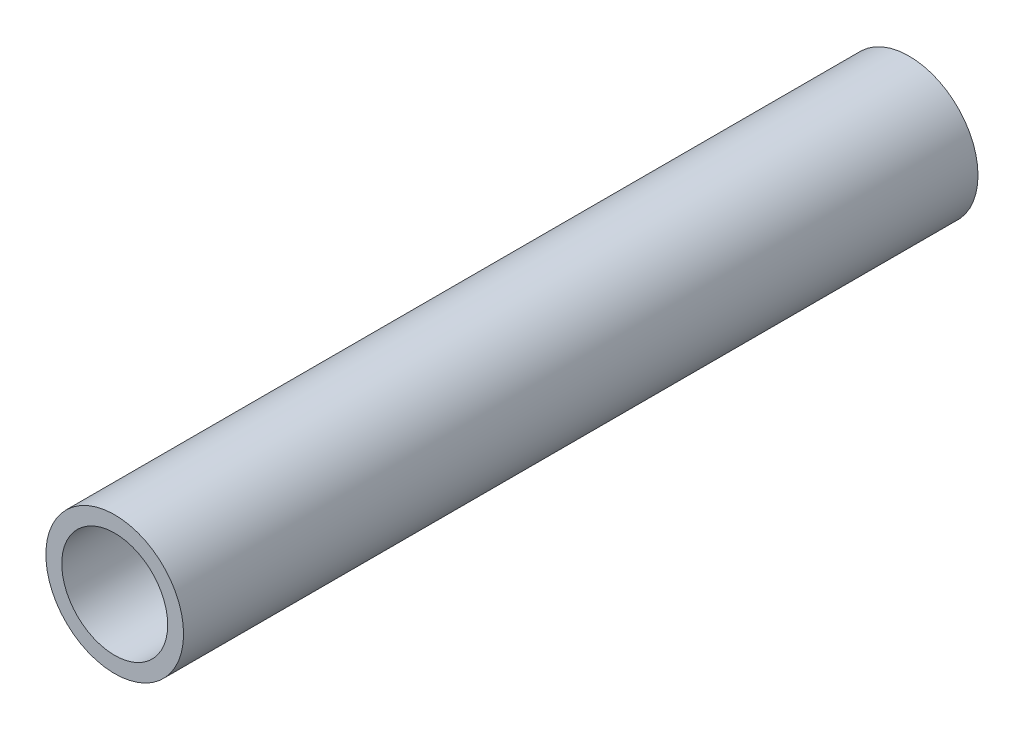
ISO-10303-21;
HEADER;
FILE_DESCRIPTION(('STEP AP214'),'2;1');
FILE_NAME('part.step','',(''),(''),'','','');
FILE_SCHEMA(('AUTOMOTIVE_DESIGN { 1 0 10303 214 1 1 1 1 }'));
ENDSEC;
DATA;
#1=APPLICATION_CONTEXT('core data for automotive mechanical design processes');
#2=APPLICATION_PROTOCOL_DEFINITION('international standard','automotive_design',2000,#1);
#3=PRODUCT_CONTEXT('',#1,'mechanical');
#4=PRODUCT('Part','Part','',(#3));
#5=PRODUCT_RELATED_PRODUCT_CATEGORY('part','',(#4));
#6=PRODUCT_DEFINITION_FORMATION('','',#4);
#7=PRODUCT_DEFINITION_CONTEXT('part definition',#1,'design');
#8=PRODUCT_DEFINITION('design','',#6,#7);
#9=PRODUCT_DEFINITION_SHAPE('','',#8);
#10=(LENGTH_UNIT() NAMED_UNIT(*) SI_UNIT(.MILLI.,.METRE.));
#11=(NAMED_UNIT(*) PLANE_ANGLE_UNIT() SI_UNIT($,.RADIAN.));
#12=(NAMED_UNIT(*) SI_UNIT($,.STERADIAN.) SOLID_ANGLE_UNIT());
#13=UNCERTAINTY_MEASURE_WITH_UNIT(LENGTH_MEASURE(1.E-05),#10,'distance_accuracy_value','');
#14=(GEOMETRIC_REPRESENTATION_CONTEXT(3) GLOBAL_UNCERTAINTY_ASSIGNED_CONTEXT((#13)) GLOBAL_UNIT_ASSIGNED_CONTEXT((#10,
#11,#12)) REPRESENTATION_CONTEXT('',''));
#15=CARTESIAN_POINT('',(0.,0.,0.));
#16=DIRECTION('',(0.,0.,1.));
#17=DIRECTION('',(1.,0.,0.));
#18=AXIS2_PLACEMENT_3D('',#15,#16,#17);
#19=CARTESIAN_POINT('',(0.,0.,190.5));
#20=DIRECTION('',(0.,0.,1.));
#21=DIRECTION('',(1.,0.,0.));
#22=AXIS2_PLACEMENT_3D('',#19,#20,#21);
#23=PLANE('',#22);
#24=CARTESIAN_POINT('',(0.,0.,190.5));
#25=DIRECTION('',(0.,0.,1.));
#26=DIRECTION('',(1.,0.,0.));
#27=AXIS2_PLACEMENT_3D('',#24,#25,#26);
#28=CIRCLE('',#27,16.51);
#29=CARTESIAN_POINT('',(16.51,0.,190.5));
#30=VERTEX_POINT('',#29);
#31=EDGE_CURVE('E10',#30,#30,#28,.T.);
#32=ORIENTED_EDGE('',*,*,#31,.T.);
#33=EDGE_LOOP('',(#32));
#34=FACE_BOUND('',#33,.T.);
#35=CARTESIAN_POINT('',(0.,0.,190.5));
#36=DIRECTION('',(0.,0.,1.));
#37=DIRECTION('',(1.,0.,0.));
#38=AXIS2_PLACEMENT_3D('',#35,#36,#37);
#39=CIRCLE('',#38,12.7);
#40=CARTESIAN_POINT('',(12.7,0.,190.5));
#41=VERTEX_POINT('',#40);
#42=EDGE_CURVE('E50',#41,#41,#39,.T.);
#43=ORIENTED_EDGE('',*,*,#42,.F.);
#44=EDGE_LOOP('',(#43));
#45=FACE_BOUND('',#44,.T.);
#46=ADVANCED_FACE('F37',(#34,#45),#23,.T.);
#47=CARTESIAN_POINT('',(0.,0.,0.));
#48=DIRECTION('',(0.,0.,1.));
#49=DIRECTION('',(1.,0.,0.));
#50=AXIS2_PLACEMENT_3D('',#47,#48,#49);
#51=PLANE('',#50);
#52=CARTESIAN_POINT('',(0.,0.,0.));
#53=DIRECTION('',(0.,0.,1.));
#54=DIRECTION('',(1.,0.,0.));
#55=AXIS2_PLACEMENT_3D('',#52,#53,#54);
#56=CIRCLE('',#55,16.51);
#57=CARTESIAN_POINT('',(16.51,0.,0.));
#58=VERTEX_POINT('',#57);
#59=EDGE_CURVE('E41',#58,#58,#56,.T.);
#60=ORIENTED_EDGE('',*,*,#59,.F.);
#61=EDGE_LOOP('',(#60));
#62=FACE_BOUND('',#61,.T.);
#63=CARTESIAN_POINT('',(0.,0.,0.));
#64=DIRECTION('',(0.,0.,1.));
#65=DIRECTION('',(1.,0.,0.));
#66=AXIS2_PLACEMENT_3D('',#63,#64,#65);
#67=CIRCLE('',#66,12.7);
#68=CARTESIAN_POINT('',(12.7,0.,0.));
#69=VERTEX_POINT('',#68);
#70=EDGE_CURVE('E52',#69,#69,#67,.T.);
#71=ORIENTED_EDGE('',*,*,#70,.T.);
#72=EDGE_LOOP('',(#71));
#73=FACE_BOUND('',#72,.T.);
#74=ADVANCED_FACE('F64',(#62,#73),#51,.F.);
#75=CARTESIAN_POINT('',(0.,0.,190.5));
#76=DIRECTION('',(0.,0.,-1.));
#77=DIRECTION('',(-1.,0.,0.));
#78=AXIS2_PLACEMENT_3D('',#75,#76,#77);
#79=CYLINDRICAL_SURFACE('',#78,16.51);
#80=ORIENTED_EDGE('',*,*,#31,.F.);
#81=EDGE_LOOP('',(#80));
#82=FACE_BOUND('',#81,.T.);
#83=ORIENTED_EDGE('',*,*,#59,.T.);
#84=EDGE_LOOP('',(#83));
#85=FACE_BOUND('',#84,.T.);
#86=ADVANCED_FACE('F39',(#82,#85),#79,.T.);
#87=CARTESIAN_POINT('',(0.,0.,190.5));
#88=DIRECTION('',(0.,0.,-1.));
#89=DIRECTION('',(-1.,0.,0.));
#90=AXIS2_PLACEMENT_3D('',#87,#88,#89);
#91=CYLINDRICAL_SURFACE('',#90,12.7);
#92=ORIENTED_EDGE('',*,*,#42,.T.);
#93=EDGE_LOOP('',(#92));
#94=FACE_BOUND('',#93,.T.);
#95=ORIENTED_EDGE('',*,*,#70,.F.);
#96=EDGE_LOOP('',(#95));
#97=FACE_BOUND('',#96,.T.);
#98=ADVANCED_FACE('F60',(#94,#97),#91,.F.);
#99=CLOSED_SHELL('',(#46,#74,#86,#98));
#100=MANIFOLD_SOLID_BREP('B2',#99);
#101=ADVANCED_BREP_SHAPE_REPRESENTATION('',(#18,#100),#14);
#102=SHAPE_DEFINITION_REPRESENTATION(#9,#101);
ENDSEC;
END-ISO-10303-21;
